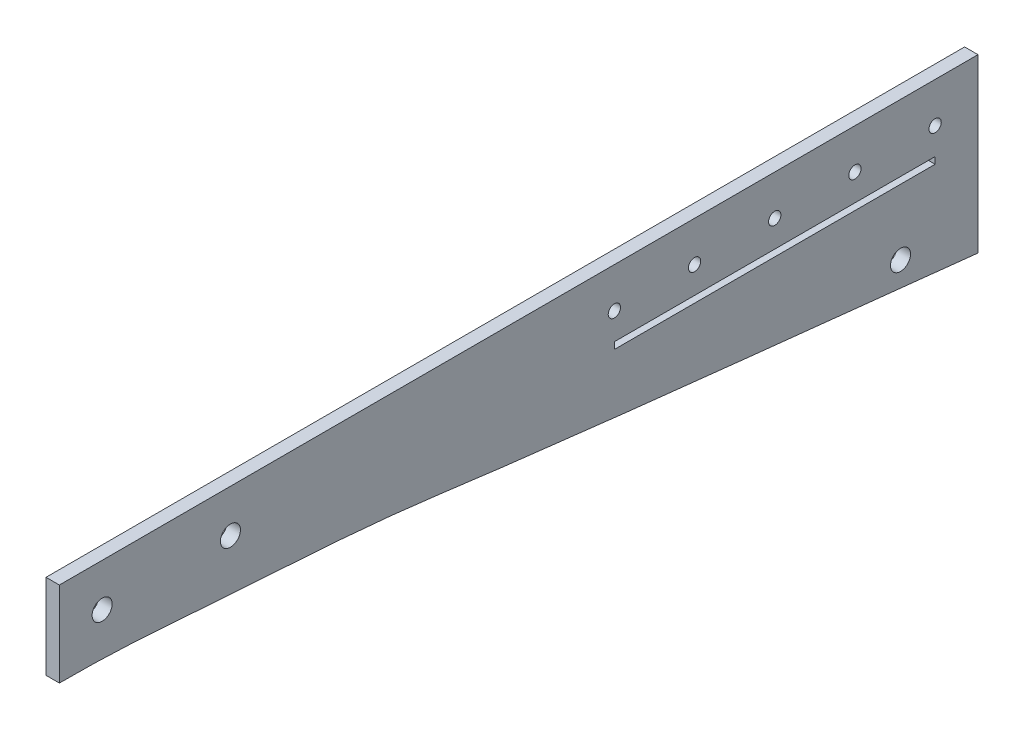
ISO-10303-21;
HEADER;
FILE_DESCRIPTION(('STEP AP214'),'2;1');
FILE_NAME('part.step','',(''),(''),'','','');
FILE_SCHEMA(('AUTOMOTIVE_DESIGN { 1 0 10303 214 1 1 1 1 }'));
ENDSEC;
DATA;
#1=APPLICATION_CONTEXT('core data for automotive mechanical design processes');
#2=APPLICATION_PROTOCOL_DEFINITION('international standard','automotive_design',2000,#1);
#3=PRODUCT_CONTEXT('',#1,'mechanical');
#4=PRODUCT('Part','Part','',(#3));
#5=PRODUCT_RELATED_PRODUCT_CATEGORY('part','',(#4));
#6=PRODUCT_DEFINITION_FORMATION('','',#4);
#7=PRODUCT_DEFINITION_CONTEXT('part definition',#1,'design');
#8=PRODUCT_DEFINITION('design','',#6,#7);
#9=PRODUCT_DEFINITION_SHAPE('','',#8);
#10=(LENGTH_UNIT() NAMED_UNIT(*) SI_UNIT(.MILLI.,.METRE.));
#11=(NAMED_UNIT(*) PLANE_ANGLE_UNIT() SI_UNIT($,.RADIAN.));
#12=(NAMED_UNIT(*) SI_UNIT($,.STERADIAN.) SOLID_ANGLE_UNIT());
#13=UNCERTAINTY_MEASURE_WITH_UNIT(LENGTH_MEASURE(1.E-05),#10,'distance_accuracy_value','');
#14=(GEOMETRIC_REPRESENTATION_CONTEXT(3) GLOBAL_UNCERTAINTY_ASSIGNED_CONTEXT((#13)) GLOBAL_UNIT_ASSIGNED_CONTEXT((#10,
#11,#12)) REPRESENTATION_CONTEXT('',''));
#15=CARTESIAN_POINT('',(0.,0.,0.));
#16=DIRECTION('',(0.,0.,1.));
#17=DIRECTION('',(1.,0.,0.));
#18=AXIS2_PLACEMENT_3D('',#15,#16,#17);
#19=CARTESIAN_POINT('',(-3.17500000000001,40.7784101367533,-130.30894448353));
#20=DIRECTION('',(1.,0.,0.));
#21=DIRECTION('',(0.,1.,0.));
#22=AXIS2_PLACEMENT_3D('',#19,#20,#21);
#23=PLANE('',#22);
#24=CARTESIAN_POINT('',(-3.17500000000001,30.48,-282.443003978403));
#25=DIRECTION('',(-1.,0.,0.));
#26=DIRECTION('',(0.,-1.,0.));
#27=AXIS2_PLACEMENT_3D('',#24,#25,#26);
#28=CIRCLE('',#27,2.38124999999995);
#29=CARTESIAN_POINT('',(-3.17500000000001,28.09875,-282.443003978403));
#30=VERTEX_POINT('',#29);
#31=EDGE_CURVE('E383',#30,#30,#28,.T.);
#32=ORIENTED_EDGE('',*,*,#31,.F.);
#33=EDGE_LOOP('',(#32));
#34=FACE_BOUND('',#33,.T.);
#35=CARTESIAN_POINT('',(-3.17500000000001,53.34,-92.7751596898495));
#36=DIRECTION('',(-1.,0.,0.));
#37=DIRECTION('',(0.,-1.,0.));
#38=AXIS2_PLACEMENT_3D('',#35,#36,#37);
#39=CIRCLE('',#38,2.38125);
#40=CARTESIAN_POINT('',(-3.17500000000001,50.95875,-92.7751596898495));
#41=VERTEX_POINT('',#40);
#42=EDGE_CURVE('E395',#41,#41,#39,.T.);
#43=ORIENTED_EDGE('',*,*,#42,.F.);
#44=EDGE_LOOP('',(#43));
#45=FACE_BOUND('',#44,.T.);
#46=CARTESIAN_POINT('',(-3.17500000000001,53.975,-214.470733083267));
#47=DIRECTION('',(-1.,0.,0.));
#48=DIRECTION('',(0.,-1.,0.));
#49=AXIS2_PLACEMENT_3D('',#46,#47,#48);
#50=CIRCLE('',#49,1.4605);
#51=CARTESIAN_POINT('',(-3.17500000000001,52.5145,-214.470733083267));
#52=VERTEX_POINT('',#51);
#53=EDGE_CURVE('E407',#52,#52,#50,.T.);
#54=ORIENTED_EDGE('',*,*,#53,.F.);
#55=EDGE_LOOP('',(#54));
#56=FACE_BOUND('',#55,.T.);
#57=CARTESIAN_POINT('',(-3.17500000000001,53.975,-271.620733083267));
#58=DIRECTION('',(-1.,0.,0.));
#59=DIRECTION('',(0.,-1.,0.));
#60=AXIS2_PLACEMENT_3D('',#57,#58,#59);
#61=CIRCLE('',#60,1.46050000000003);
#62=CARTESIAN_POINT('',(-3.17500000000001,52.5145,-271.620733083267));
#63=VERTEX_POINT('',#62);
#64=EDGE_CURVE('E131',#63,#63,#61,.T.);
#65=ORIENTED_EDGE('',*,*,#64,.F.);
#66=EDGE_LOOP('',(#65));
#67=FACE_BOUND('',#66,.T.);
#68=CARTESIAN_POINT('',(-3.17500000000001,43.3229282463699,-82.6151596898495));
#69=CARTESIAN_POINT('',(-3.17500000000001,43.3692227671806,-90.0325714773695));
#70=CARTESIAN_POINT('',(-3.17500000000001,42.9477476353276,-100.839437877737));
#71=CARTESIAN_POINT('',(-3.17500000000001,40.7341354720517,-128.258124464792));
#72=CARTESIAN_POINT('',(-3.17500000000001,39.5878222999372,-154.037568885067));
#73=CARTESIAN_POINT('',(-3.17500000000001,32.8482395620206,-203.771460985553));
#74=CARTESIAN_POINT('',(-3.17500000000001,27.1845585453096,-259.026017551498));
#75=CARTESIAN_POINT('',(-3.17500000000001,22.8294413784057,-299.505029795659));
#76=CARTESIAN_POINT('',(-3.17500000000001,22.6836142738887,-300.858003978388));
#77=B_SPLINE_CURVE_WITH_KNOTS('',3,(#68,#69,#70,#71,#72,#73,#74,#75,#76),.UNSPECIFIED.,.F.,.F.,
(4,1,1,1,1,1,4),(0.059441296217129,0.115503882074529,0.140922658912423,0.264510712533762,
0.30679732312031,0.521502154191359,0.528962462252977),.UNSPECIFIED.);
#78=CARTESIAN_POINT('',(-3.17500000000001,22.6836142738886,-300.858003978388));
#79=VERTEX_POINT('',#78);
#80=CARTESIAN_POINT('',(-3.17500000000001,43.3229282463699,-82.6151596898495));
#81=VERTEX_POINT('',#80);
#82=EDGE_CURVE('E165',#79,#81,#77,.F.);
#83=ORIENTED_EDGE('',*,*,#82,.T.);
#84=DIRECTION('',(0.,1.,0.));
#85=VECTOR('',#84,1.);
#86=CARTESIAN_POINT('',(-3.17500000000001,43.3229282463699,-82.6151596898495));
#87=LINE('',#86,#85);
#88=CARTESIAN_POINT('',(-3.17500000000001,63.5,-82.6151596898495));
#89=VERTEX_POINT('',#88);
#90=EDGE_CURVE('E150',#81,#89,#87,.T.);
#91=ORIENTED_EDGE('',*,*,#90,.T.);
#92=DIRECTION('',(0.,0.,-1.));
#93=VECTOR('',#92,1.);
#94=CARTESIAN_POINT('',(-3.17500000000001,63.5,-82.6151596898495));
#95=LINE('',#94,#93);
#96=CARTESIAN_POINT('',(-3.17500000000001,63.5,-300.858003978403));
#97=VERTEX_POINT('',#96);
#98=EDGE_CURVE('E144',#89,#97,#95,.T.);
#99=ORIENTED_EDGE('',*,*,#98,.T.);
#100=DIRECTION('',(0.,-1.,3.84886008865701E-13));
#101=VECTOR('',#100,1.);
#102=CARTESIAN_POINT('',(-3.17500000000001,63.5,-300.858003978403));
#103=LINE('',#102,#101);
#104=EDGE_CURVE('E149',#97,#79,#103,.T.);
#105=ORIENTED_EDGE('',*,*,#104,.T.);
#106=EDGE_LOOP('',(#83,#91,#99,#105));
#107=FACE_BOUND('',#106,.T.);
#108=DIRECTION('',(0.,-1.,0.));
#109=VECTOR('',#108,1.);
#110=CARTESIAN_POINT('',(-3.17500000000001,47.625,-290.670733083267));
#111=LINE('',#110,#109);
#112=CARTESIAN_POINT('',(-3.17500000000001,47.625,-290.670733083267));
#113=VERTEX_POINT('',#112);
#114=CARTESIAN_POINT('',(-3.17500000000001,46.0375,-290.670733083267));
#115=VERTEX_POINT('',#114);
#116=EDGE_CURVE('E101',#113,#115,#111,.T.);
#117=ORIENTED_EDGE('',*,*,#116,.F.);
#118=DIRECTION('',(0.,0.,-1.));
#119=VECTOR('',#118,1.);
#120=CARTESIAN_POINT('',(-3.17500000000001,47.625,-290.670733083267));
#121=LINE('',#120,#119);
#122=CARTESIAN_POINT('',(-3.17500000000001,47.625,-214.470733083267));
#123=VERTEX_POINT('',#122);
#124=EDGE_CURVE('E125',#123,#113,#121,.T.);
#125=ORIENTED_EDGE('',*,*,#124,.F.);
#126=DIRECTION('',(0.,1.,0.));
#127=VECTOR('',#126,1.);
#128=CARTESIAN_POINT('',(-3.17500000000001,47.625,-214.470733083267));
#129=LINE('',#128,#127);
#130=CARTESIAN_POINT('',(-3.17500000000001,46.0375,-214.470733083267));
#131=VERTEX_POINT('',#130);
#132=EDGE_CURVE('E123',#131,#123,#129,.T.);
#133=ORIENTED_EDGE('',*,*,#132,.F.);
#134=DIRECTION('',(0.,0.,1.));
#135=VECTOR('',#134,1.);
#136=CARTESIAN_POINT('',(-3.17500000000001,46.0375,-290.670733083267));
#137=LINE('',#136,#135);
#138=EDGE_CURVE('E110',#115,#131,#137,.T.);
#139=ORIENTED_EDGE('',*,*,#138,.F.);
#140=EDGE_LOOP('',(#117,#125,#133,#139));
#141=FACE_BOUND('',#140,.T.);
#142=CARTESIAN_POINT('',(-3.17500000000001,53.975,-233.520733083267));
#143=DIRECTION('',(-1.,0.,0.));
#144=DIRECTION('',(0.,-1.,0.));
#145=AXIS2_PLACEMENT_3D('',#142,#143,#144);
#146=CIRCLE('',#145,1.4605);
#147=CARTESIAN_POINT('',(-3.17500000000001,52.5145,-233.520733083267));
#148=VERTEX_POINT('',#147);
#149=EDGE_CURVE('E413',#148,#148,#146,.T.);
#150=ORIENTED_EDGE('',*,*,#149,.F.);
#151=EDGE_LOOP('',(#150));
#152=FACE_BOUND('',#151,.T.);
#153=CARTESIAN_POINT('',(-3.17500000000001,53.34,-123.25515968985));
#154=DIRECTION('',(-1.,0.,0.));
#155=DIRECTION('',(0.,-1.,0.));
#156=AXIS2_PLACEMENT_3D('',#153,#154,#155);
#157=CIRCLE('',#156,2.38125);
#158=CARTESIAN_POINT('',(-3.17500000000001,50.95875,-123.25515968985));
#159=VERTEX_POINT('',#158);
#160=EDGE_CURVE('E401',#159,#159,#157,.T.);
#161=ORIENTED_EDGE('',*,*,#160,.F.);
#162=EDGE_LOOP('',(#161));
#163=FACE_BOUND('',#162,.T.);
#164=CARTESIAN_POINT('',(-3.17500000000001,53.975,-290.670733083267));
#165=DIRECTION('',(-1.,0.,0.));
#166=DIRECTION('',(0.,-1.,0.));
#167=AXIS2_PLACEMENT_3D('',#164,#165,#166);
#168=CIRCLE('',#167,1.46050000000003);
#169=CARTESIAN_POINT('',(-3.17500000000001,52.5145,-290.670733083267));
#170=VERTEX_POINT('',#169);
#171=EDGE_CURVE('E389',#170,#170,#168,.T.);
#172=ORIENTED_EDGE('',*,*,#171,.F.);
#173=EDGE_LOOP('',(#172));
#174=FACE_BOUND('',#173,.T.);
#175=CARTESIAN_POINT('',(-3.17500000000001,53.975,-252.570733083267));
#176=DIRECTION('',(-1.,0.,0.));
#177=DIRECTION('',(0.,-1.,0.));
#178=AXIS2_PLACEMENT_3D('',#175,#176,#177);
#179=CIRCLE('',#178,1.46049999999997);
#180=CARTESIAN_POINT('',(-3.17500000000001,52.5145,-252.570733083267));
#181=VERTEX_POINT('',#180);
#182=EDGE_CURVE('E374',#181,#181,#179,.T.);
#183=ORIENTED_EDGE('',*,*,#182,.F.);
#184=EDGE_LOOP('',(#183));
#185=FACE_BOUND('',#184,.T.);
#186=ADVANCED_FACE('F32',(#34,#45,#56,#67,#107,#141,#152,#163,#174,#185),#23,.F.);
#187=CARTESIAN_POINT('',(0.,40.7784101367533,-130.30894448353));
#188=DIRECTION('',(1.,0.,0.));
#189=DIRECTION('',(0.,1.,0.));
#190=AXIS2_PLACEMENT_3D('',#187,#188,#189);
#191=PLANE('',#190);
#192=CARTESIAN_POINT('',(0.,30.48,-282.443003978403));
#193=DIRECTION('',(-1.,0.,0.));
#194=DIRECTION('',(0.,-1.,0.));
#195=AXIS2_PLACEMENT_3D('',#192,#193,#194);
#196=CIRCLE('',#195,2.38124999999995);
#197=CARTESIAN_POINT('',(0.,28.09875,-282.443003978403));
#198=VERTEX_POINT('',#197);
#199=EDGE_CURVE('E380',#198,#198,#196,.T.);
#200=ORIENTED_EDGE('',*,*,#199,.T.);
#201=EDGE_LOOP('',(#200));
#202=FACE_BOUND('',#201,.T.);
#203=CARTESIAN_POINT('',(0.,53.34,-92.7751596898495));
#204=DIRECTION('',(-1.,0.,0.));
#205=DIRECTION('',(0.,-1.,0.));
#206=AXIS2_PLACEMENT_3D('',#203,#204,#205);
#207=CIRCLE('',#206,2.38125);
#208=CARTESIAN_POINT('',(0.,50.95875,-92.7751596898495));
#209=VERTEX_POINT('',#208);
#210=EDGE_CURVE('E392',#209,#209,#207,.T.);
#211=ORIENTED_EDGE('',*,*,#210,.T.);
#212=EDGE_LOOP('',(#211));
#213=FACE_BOUND('',#212,.T.);
#214=CARTESIAN_POINT('',(0.,53.975,-214.470733083267));
#215=DIRECTION('',(-1.,0.,0.));
#216=DIRECTION('',(0.,-1.,0.));
#217=AXIS2_PLACEMENT_3D('',#214,#215,#216);
#218=CIRCLE('',#217,1.4605);
#219=CARTESIAN_POINT('',(0.,52.5145,-214.470733083267));
#220=VERTEX_POINT('',#219);
#221=EDGE_CURVE('E404',#220,#220,#218,.T.);
#222=ORIENTED_EDGE('',*,*,#221,.T.);
#223=EDGE_LOOP('',(#222));
#224=FACE_BOUND('',#223,.T.);
#225=CARTESIAN_POINT('',(0.,53.975,-271.620733083267));
#226=DIRECTION('',(-1.,0.,0.));
#227=DIRECTION('',(0.,-1.,0.));
#228=AXIS2_PLACEMENT_3D('',#225,#226,#227);
#229=CIRCLE('',#228,1.46050000000003);
#230=CARTESIAN_POINT('',(0.,52.5145,-271.620733083267));
#231=VERTEX_POINT('',#230);
#232=EDGE_CURVE('E416',#231,#231,#229,.T.);
#233=ORIENTED_EDGE('',*,*,#232,.T.);
#234=EDGE_LOOP('',(#233));
#235=FACE_BOUND('',#234,.T.);
#236=CARTESIAN_POINT('',(0.,22.6836142738887,-300.858003978388));
#237=CARTESIAN_POINT('',(0.,22.8294413784057,-299.505029795659));
#238=CARTESIAN_POINT('',(0.,27.1845585453096,-259.026017551498));
#239=CARTESIAN_POINT('',(0.,32.8482395620206,-203.771460985553));
#240=CARTESIAN_POINT('',(0.,39.5878222999372,-154.037568885067));
#241=CARTESIAN_POINT('',(0.,40.7341354720517,-128.258124464792));
#242=CARTESIAN_POINT('',(0.,42.9477476353276,-100.839437877737));
#243=CARTESIAN_POINT('',(0.,43.3692227671806,-90.0325714773695));
#244=CARTESIAN_POINT('',(0.,43.3229282463699,-82.6151596898495));
#245=B_SPLINE_CURVE_WITH_KNOTS('',3,(#236,#237,#238,#239,#240,#241,#242,#243,#244),
.UNSPECIFIED.,.F.,.F.,(4,1,1,1,1,1,4),(0.059441296217129,0.0669016042787479,0.281606435349796,
0.323893045936344,0.447481099557684,0.472899876395578,0.528962462252977),.UNSPECIFIED.);
#246=CARTESIAN_POINT('',(0.,22.6836142738886,-300.858003978388));
#247=VERTEX_POINT('',#246);
#248=CARTESIAN_POINT('',(0.,43.3229282463699,-82.6151596898495));
#249=VERTEX_POINT('',#248);
#250=EDGE_CURVE('E118',#247,#249,#245,.T.);
#251=ORIENTED_EDGE('',*,*,#250,.F.);
#252=DIRECTION('',(0.,-1.,3.84886008865701E-13));
#253=VECTOR('',#252,1.);
#254=CARTESIAN_POINT('',(0.,63.5,-300.858003978403));
#255=LINE('',#254,#253);
#256=CARTESIAN_POINT('',(0.,63.5,-300.858003978403));
#257=VERTEX_POINT('',#256);
#258=EDGE_CURVE('E153',#257,#247,#255,.T.);
#259=ORIENTED_EDGE('',*,*,#258,.F.);
#260=DIRECTION('',(0.,0.,-1.));
#261=VECTOR('',#260,1.);
#262=CARTESIAN_POINT('',(0.,63.5,-82.6151596898495));
#263=LINE('',#262,#261);
#264=CARTESIAN_POINT('',(0.,63.5,-82.6151596898495));
#265=VERTEX_POINT('',#264);
#266=EDGE_CURVE('E151',#265,#257,#263,.T.);
#267=ORIENTED_EDGE('',*,*,#266,.F.);
#268=DIRECTION('',(0.,1.,0.));
#269=VECTOR('',#268,1.);
#270=CARTESIAN_POINT('',(0.,43.3229282463699,-82.6151596898495));
#271=LINE('',#270,#269);
#272=EDGE_CURVE('E154',#249,#265,#271,.T.);
#273=ORIENTED_EDGE('',*,*,#272,.F.);
#274=EDGE_LOOP('',(#251,#259,#267,#273));
#275=FACE_BOUND('',#274,.T.);
#276=DIRECTION('',(0.,0.,-1.));
#277=VECTOR('',#276,1.);
#278=CARTESIAN_POINT('',(0.,47.625,-290.670733083267));
#279=LINE('',#278,#277);
#280=CARTESIAN_POINT('',(0.,47.625,-214.470733083267));
#281=VERTEX_POINT('',#280);
#282=CARTESIAN_POINT('',(0.,47.625,-290.670733083267));
#283=VERTEX_POINT('',#282);
#284=EDGE_CURVE('E111',#281,#283,#279,.T.);
#285=ORIENTED_EDGE('',*,*,#284,.T.);
#286=DIRECTION('',(0.,-1.,0.));
#287=VECTOR('',#286,1.);
#288=CARTESIAN_POINT('',(0.,47.625,-290.670733083267));
#289=LINE('',#288,#287);
#290=CARTESIAN_POINT('',(0.,46.0375,-290.670733083267));
#291=VERTEX_POINT('',#290);
#292=EDGE_CURVE('E59',#283,#291,#289,.T.);
#293=ORIENTED_EDGE('',*,*,#292,.T.);
#294=DIRECTION('',(0.,0.,1.));
#295=VECTOR('',#294,1.);
#296=CARTESIAN_POINT('',(0.,46.0375,-290.670733083267));
#297=LINE('',#296,#295);
#298=CARTESIAN_POINT('',(0.,46.0375,-214.470733083267));
#299=VERTEX_POINT('',#298);
#300=EDGE_CURVE('E117',#291,#299,#297,.T.);
#301=ORIENTED_EDGE('',*,*,#300,.T.);
#302=DIRECTION('',(0.,1.,0.));
#303=VECTOR('',#302,1.);
#304=CARTESIAN_POINT('',(0.,47.625,-214.470733083267));
#305=LINE('',#304,#303);
#306=EDGE_CURVE('E133',#299,#281,#305,.T.);
#307=ORIENTED_EDGE('',*,*,#306,.T.);
#308=EDGE_LOOP('',(#285,#293,#301,#307));
#309=FACE_BOUND('',#308,.T.);
#310=CARTESIAN_POINT('',(0.,53.975,-233.520733083267));
#311=DIRECTION('',(-1.,0.,0.));
#312=DIRECTION('',(0.,-1.,0.));
#313=AXIS2_PLACEMENT_3D('',#310,#311,#312);
#314=CIRCLE('',#313,1.4605);
#315=CARTESIAN_POINT('',(0.,52.5145,-233.520733083267));
#316=VERTEX_POINT('',#315);
#317=EDGE_CURVE('E410',#316,#316,#314,.T.);
#318=ORIENTED_EDGE('',*,*,#317,.T.);
#319=EDGE_LOOP('',(#318));
#320=FACE_BOUND('',#319,.T.);
#321=CARTESIAN_POINT('',(0.,53.34,-123.25515968985));
#322=DIRECTION('',(-1.,0.,0.));
#323=DIRECTION('',(0.,-1.,0.));
#324=AXIS2_PLACEMENT_3D('',#321,#322,#323);
#325=CIRCLE('',#324,2.38125);
#326=CARTESIAN_POINT('',(0.,50.95875,-123.25515968985));
#327=VERTEX_POINT('',#326);
#328=EDGE_CURVE('E398',#327,#327,#325,.T.);
#329=ORIENTED_EDGE('',*,*,#328,.T.);
#330=EDGE_LOOP('',(#329));
#331=FACE_BOUND('',#330,.T.);
#332=CARTESIAN_POINT('',(0.,53.975,-290.670733083267));
#333=DIRECTION('',(-1.,0.,0.));
#334=DIRECTION('',(0.,-1.,0.));
#335=AXIS2_PLACEMENT_3D('',#332,#333,#334);
#336=CIRCLE('',#335,1.46050000000003);
#337=CARTESIAN_POINT('',(0.,52.5145,-290.670733083267));
#338=VERTEX_POINT('',#337);
#339=EDGE_CURVE('E386',#338,#338,#336,.T.);
#340=ORIENTED_EDGE('',*,*,#339,.T.);
#341=EDGE_LOOP('',(#340));
#342=FACE_BOUND('',#341,.T.);
#343=CARTESIAN_POINT('',(0.,53.975,-252.570733083267));
#344=DIRECTION('',(-1.,0.,0.));
#345=DIRECTION('',(0.,-1.,0.));
#346=AXIS2_PLACEMENT_3D('',#343,#344,#345);
#347=CIRCLE('',#346,1.46049999999997);
#348=CARTESIAN_POINT('',(0.,52.5145,-252.570733083267));
#349=VERTEX_POINT('',#348);
#350=EDGE_CURVE('E377',#349,#349,#347,.T.);
#351=ORIENTED_EDGE('',*,*,#350,.T.);
#352=EDGE_LOOP('',(#351));
#353=FACE_BOUND('',#352,.T.);
#354=ADVANCED_FACE('F181',(#202,#213,#224,#235,#275,#309,#320,#331,#342,#353),#191,.T.);
#355=CARTESIAN_POINT('',(-3.17500000000001,20.6250512350006,-319.796703156955));
#356=CARTESIAN_POINT('',(-3.17500000000001,21.4470760235708,-312.297426065501));
#357=CARTESIAN_POINT('',(-3.17500000000001,26.4238026262619,-266.447909928182));
#358=CARTESIAN_POINT('',(-3.17500000000001,32.8482395620206,-203.771460985553));
#359=CARTESIAN_POINT('',(-3.17500000000001,39.5878222999372,-154.037568885067));
#360=CARTESIAN_POINT('',(-3.17500000000001,40.7341354720517,-128.258124464792));
#361=CARTESIAN_POINT('',(-3.17500000000001,43.3111951964629,-96.3376308607162));
#362=CARTESIAN_POINT('',(-3.17500000000001,43.8548371209846,-71.1195145592283));
#363=CARTESIAN_POINT('',(-3.17500000000001,39.5909848646941,-40.8950313271756));
#364=CARTESIAN_POINT('',(-3.17500000000001,34.7665269990676,-17.4215267783529));
#365=CARTESIAN_POINT('',(-3.17500000000001,30.2941403013763,0.946339756623144));
#366=CARTESIAN_POINT('',(-3.17500000000001,24.5311569093459,12.0337907686125));
#367=CARTESIAN_POINT('',(-3.17500000000001,20.6477769140798,17.7732218134462));
#368=CARTESIAN_POINT('',(-3.17500000000001,19.4181975790566,19.4436906483839));
#369=B_SPLINE_CURVE_WITH_KNOTS('',3,(#355,#356,#357,#358,#359,#360,#361,#362,#363,#364,#365,
#366,#367,#368),.UNSPECIFIED.,.F.,.F.,(4,1,1,1,1,1,1,1,1,1,1,4),(0.0239196569673538,
0.0669016042787479,0.281606435349796,0.323893045936344,0.447481099557684,0.472899876395578,
0.562632307612615,0.638258740173895,0.701932353586762,0.743677549842096,0.780003047829055,
0.795578271148197),.UNSPECIFIED.);
#370=DIRECTION('',(1.,0.,0.));
#371=VECTOR('',#370,1.);
#372=SURFACE_OF_LINEAR_EXTRUSION('',#369,#371);
#373=ORIENTED_EDGE('',*,*,#250,.T.);
#374=DIRECTION('',(1.,0.,0.));
#375=VECTOR('',#374,1.);
#376=CARTESIAN_POINT('',(-3.17500000000001,43.3229282463699,-82.6151596898495));
#377=LINE('',#376,#375);
#378=EDGE_CURVE('E11',#81,#249,#377,.T.);
#379=ORIENTED_EDGE('',*,*,#378,.F.);
#380=ORIENTED_EDGE('',*,*,#82,.F.);
#381=DIRECTION('',(1.,0.,0.));
#382=VECTOR('',#381,1.);
#383=CARTESIAN_POINT('',(-3.17500000000001,22.6836142738886,-300.858003978388));
#384=LINE('',#383,#382);
#385=EDGE_CURVE('E158',#79,#247,#384,.T.);
#386=ORIENTED_EDGE('',*,*,#385,.T.);
#387=EDGE_LOOP('',(#373,#379,#380,#386));
#388=FACE_BOUND('',#387,.T.);
#389=ADVANCED_FACE('F34',(#388),#372,.F.);
#390=CARTESIAN_POINT('',(-3.17500000000001,43.3229282463699,-82.6151596898495));
#391=DIRECTION('',(0.,0.,-1.));
#392=DIRECTION('',(-1.,0.,0.));
#393=AXIS2_PLACEMENT_3D('',#390,#391,#392);
#394=PLANE('',#393);
#395=ORIENTED_EDGE('',*,*,#272,.T.);
#396=DIRECTION('',(1.,0.,0.));
#397=VECTOR('',#396,1.);
#398=CARTESIAN_POINT('',(-3.17500000000001,63.5,-82.6151596898495));
#399=LINE('',#398,#397);
#400=EDGE_CURVE('E43',#89,#265,#399,.T.);
#401=ORIENTED_EDGE('',*,*,#400,.F.);
#402=ORIENTED_EDGE('',*,*,#90,.F.);
#403=ORIENTED_EDGE('',*,*,#378,.T.);
#404=EDGE_LOOP('',(#395,#401,#402,#403));
#405=FACE_BOUND('',#404,.T.);
#406=ADVANCED_FACE('F252',(#405),#394,.F.);
#407=CARTESIAN_POINT('',(-3.17500000000001,63.5,-82.6151596898495));
#408=DIRECTION('',(0.,-1.,0.));
#409=DIRECTION('',(1.,0.,0.));
#410=AXIS2_PLACEMENT_3D('',#407,#408,#409);
#411=PLANE('',#410);
#412=ORIENTED_EDGE('',*,*,#266,.T.);
#413=DIRECTION('',(1.,0.,0.));
#414=VECTOR('',#413,1.);
#415=CARTESIAN_POINT('',(-3.17500000000001,63.5,-300.858003978403));
#416=LINE('',#415,#414);
#417=EDGE_CURVE('E155',#97,#257,#416,.T.);
#418=ORIENTED_EDGE('',*,*,#417,.F.);
#419=ORIENTED_EDGE('',*,*,#98,.F.);
#420=ORIENTED_EDGE('',*,*,#400,.T.);
#421=EDGE_LOOP('',(#412,#418,#419,#420));
#422=FACE_BOUND('',#421,.T.);
#423=ADVANCED_FACE('F251',(#422),#411,.F.);
#424=CARTESIAN_POINT('',(-3.17500000000001,63.5,-300.858003978403));
#425=DIRECTION('',(0.,3.84886008865701E-13,1.));
#426=DIRECTION('',(0.,-1.,3.84886008865701E-13));
#427=AXIS2_PLACEMENT_3D('',#424,#425,#426);
#428=PLANE('',#427);
#429=ORIENTED_EDGE('',*,*,#258,.T.);
#430=ORIENTED_EDGE('',*,*,#385,.F.);
#431=ORIENTED_EDGE('',*,*,#104,.F.);
#432=ORIENTED_EDGE('',*,*,#417,.T.);
#433=EDGE_LOOP('',(#429,#430,#431,#432));
#434=FACE_BOUND('',#433,.T.);
#435=ADVANCED_FACE('F188',(#434),#428,.F.);
#436=CARTESIAN_POINT('',(-3.17500000000001,47.625,-290.670733083267));
#437=DIRECTION('',(0.,0.,1.));
#438=DIRECTION('',(1.,0.,0.));
#439=AXIS2_PLACEMENT_3D('',#436,#437,#438);
#440=PLANE('',#439);
#441=ORIENTED_EDGE('',*,*,#292,.F.);
#442=DIRECTION('',(1.,0.,0.));
#443=VECTOR('',#442,1.);
#444=CARTESIAN_POINT('',(-3.17500000000001,47.625,-290.670733083267));
#445=LINE('',#444,#443);
#446=EDGE_CURVE('E105',#113,#283,#445,.T.);
#447=ORIENTED_EDGE('',*,*,#446,.F.);
#448=ORIENTED_EDGE('',*,*,#116,.T.);
#449=DIRECTION('',(1.,0.,0.));
#450=VECTOR('',#449,1.);
#451=CARTESIAN_POINT('',(-3.17500000000001,46.0375,-290.670733083267));
#452=LINE('',#451,#450);
#453=EDGE_CURVE('E104',#115,#291,#452,.T.);
#454=ORIENTED_EDGE('',*,*,#453,.T.);
#455=EDGE_LOOP('',(#441,#447,#448,#454));
#456=FACE_BOUND('',#455,.T.);
#457=ADVANCED_FACE('F103',(#456),#440,.T.);
#458=CARTESIAN_POINT('',(-3.17500000000001,46.0375,-290.670733083267));
#459=DIRECTION('',(0.,1.,0.));
#460=DIRECTION('',(-1.,0.,0.));
#461=AXIS2_PLACEMENT_3D('',#458,#459,#460);
#462=PLANE('',#461);
#463=ORIENTED_EDGE('',*,*,#300,.F.);
#464=ORIENTED_EDGE('',*,*,#453,.F.);
#465=ORIENTED_EDGE('',*,*,#138,.T.);
#466=DIRECTION('',(1.,0.,0.));
#467=VECTOR('',#466,1.);
#468=CARTESIAN_POINT('',(-3.17500000000001,46.0375,-214.470733083267));
#469=LINE('',#468,#467);
#470=EDGE_CURVE('E119',#131,#299,#469,.T.);
#471=ORIENTED_EDGE('',*,*,#470,.T.);
#472=EDGE_LOOP('',(#463,#464,#465,#471));
#473=FACE_BOUND('',#472,.T.);
#474=ADVANCED_FACE('F114',(#473),#462,.T.);
#475=CARTESIAN_POINT('',(-3.17500000000001,47.625,-214.470733083267));
#476=DIRECTION('',(0.,0.,-1.));
#477=DIRECTION('',(-1.,0.,0.));
#478=AXIS2_PLACEMENT_3D('',#475,#476,#477);
#479=PLANE('',#478);
#480=ORIENTED_EDGE('',*,*,#306,.F.);
#481=ORIENTED_EDGE('',*,*,#470,.F.);
#482=ORIENTED_EDGE('',*,*,#132,.T.);
#483=DIRECTION('',(1.,0.,0.));
#484=VECTOR('',#483,1.);
#485=CARTESIAN_POINT('',(-3.17500000000001,47.625,-214.470733083267));
#486=LINE('',#485,#484);
#487=EDGE_CURVE('E51',#123,#281,#486,.T.);
#488=ORIENTED_EDGE('',*,*,#487,.T.);
#489=EDGE_LOOP('',(#480,#481,#482,#488));
#490=FACE_BOUND('',#489,.T.);
#491=ADVANCED_FACE('F292',(#490),#479,.T.);
#492=CARTESIAN_POINT('',(-3.17500000000001,47.625,-290.670733083267));
#493=DIRECTION('',(0.,-1.,0.));
#494=DIRECTION('',(0.,0.,-1.));
#495=AXIS2_PLACEMENT_3D('',#492,#493,#494);
#496=PLANE('',#495);
#497=ORIENTED_EDGE('',*,*,#284,.F.);
#498=ORIENTED_EDGE('',*,*,#487,.F.);
#499=ORIENTED_EDGE('',*,*,#124,.T.);
#500=ORIENTED_EDGE('',*,*,#446,.T.);
#501=EDGE_LOOP('',(#497,#498,#499,#500));
#502=FACE_BOUND('',#501,.T.);
#503=ADVANCED_FACE('F298',(#502),#496,.T.);
#504=CARTESIAN_POINT('',(-3.17500000000001,53.975,-271.620733083267));
#505=DIRECTION('',(1.,0.,0.));
#506=DIRECTION('',(0.,1.,0.));
#507=AXIS2_PLACEMENT_3D('',#504,#505,#506);
#508=CYLINDRICAL_SURFACE('',#507,1.46050000000003);
#509=ORIENTED_EDGE('',*,*,#64,.T.);
#510=EDGE_LOOP('',(#509));
#511=FACE_BOUND('',#510,.T.);
#512=ORIENTED_EDGE('',*,*,#232,.F.);
#513=EDGE_LOOP('',(#512));
#514=FACE_BOUND('',#513,.T.);
#515=ADVANCED_FACE('F306',(#511,#514),#508,.F.);
#516=CARTESIAN_POINT('',(-3.17500000000001,53.975,-233.520733083267));
#517=DIRECTION('',(1.,0.,0.));
#518=DIRECTION('',(0.,1.,0.));
#519=AXIS2_PLACEMENT_3D('',#516,#517,#518);
#520=CYLINDRICAL_SURFACE('',#519,1.4605);
#521=ORIENTED_EDGE('',*,*,#149,.T.);
#522=EDGE_LOOP('',(#521));
#523=FACE_BOUND('',#522,.T.);
#524=ORIENTED_EDGE('',*,*,#317,.F.);
#525=EDGE_LOOP('',(#524));
#526=FACE_BOUND('',#525,.T.);
#527=ADVANCED_FACE('F313',(#523,#526),#520,.F.);
#528=CARTESIAN_POINT('',(-3.17500000000001,53.975,-214.470733083267));
#529=DIRECTION('',(1.,0.,0.));
#530=DIRECTION('',(0.,1.,0.));
#531=AXIS2_PLACEMENT_3D('',#528,#529,#530);
#532=CYLINDRICAL_SURFACE('',#531,1.4605);
#533=ORIENTED_EDGE('',*,*,#53,.T.);
#534=EDGE_LOOP('',(#533));
#535=FACE_BOUND('',#534,.T.);
#536=ORIENTED_EDGE('',*,*,#221,.F.);
#537=EDGE_LOOP('',(#536));
#538=FACE_BOUND('',#537,.T.);
#539=ADVANCED_FACE('F321',(#535,#538),#532,.F.);
#540=CARTESIAN_POINT('',(-3.17500000000001,53.34,-123.25515968985));
#541=DIRECTION('',(1.,0.,0.));
#542=DIRECTION('',(0.,1.,0.));
#543=AXIS2_PLACEMENT_3D('',#540,#541,#542);
#544=CYLINDRICAL_SURFACE('',#543,2.38125);
#545=ORIENTED_EDGE('',*,*,#160,.T.);
#546=EDGE_LOOP('',(#545));
#547=FACE_BOUND('',#546,.T.);
#548=ORIENTED_EDGE('',*,*,#328,.F.);
#549=EDGE_LOOP('',(#548));
#550=FACE_BOUND('',#549,.T.);
#551=ADVANCED_FACE('F329',(#547,#550),#544,.F.);
#552=CARTESIAN_POINT('',(-3.17500000000001,53.34,-92.7751596898495));
#553=DIRECTION('',(1.,0.,0.));
#554=DIRECTION('',(0.,1.,0.));
#555=AXIS2_PLACEMENT_3D('',#552,#553,#554);
#556=CYLINDRICAL_SURFACE('',#555,2.38125);
#557=ORIENTED_EDGE('',*,*,#42,.T.);
#558=EDGE_LOOP('',(#557));
#559=FACE_BOUND('',#558,.T.);
#560=ORIENTED_EDGE('',*,*,#210,.F.);
#561=EDGE_LOOP('',(#560));
#562=FACE_BOUND('',#561,.T.);
#563=ADVANCED_FACE('F337',(#559,#562),#556,.F.);
#564=CARTESIAN_POINT('',(-3.17500000000001,53.975,-290.670733083267));
#565=DIRECTION('',(1.,0.,0.));
#566=DIRECTION('',(0.,1.,0.));
#567=AXIS2_PLACEMENT_3D('',#564,#565,#566);
#568=CYLINDRICAL_SURFACE('',#567,1.46050000000003);
#569=ORIENTED_EDGE('',*,*,#171,.T.);
#570=EDGE_LOOP('',(#569));
#571=FACE_BOUND('',#570,.T.);
#572=ORIENTED_EDGE('',*,*,#339,.F.);
#573=EDGE_LOOP('',(#572));
#574=FACE_BOUND('',#573,.T.);
#575=ADVANCED_FACE('F345',(#571,#574),#568,.F.);
#576=CARTESIAN_POINT('',(-3.17500000000001,30.48,-282.443003978403));
#577=DIRECTION('',(1.,0.,0.));
#578=DIRECTION('',(0.,1.,0.));
#579=AXIS2_PLACEMENT_3D('',#576,#577,#578);
#580=CYLINDRICAL_SURFACE('',#579,2.38124999999995);
#581=ORIENTED_EDGE('',*,*,#31,.T.);
#582=EDGE_LOOP('',(#581));
#583=FACE_BOUND('',#582,.T.);
#584=ORIENTED_EDGE('',*,*,#199,.F.);
#585=EDGE_LOOP('',(#584));
#586=FACE_BOUND('',#585,.T.);
#587=ADVANCED_FACE('F353',(#583,#586),#580,.F.);
#588=CARTESIAN_POINT('',(-3.17500000000001,53.975,-252.570733083267));
#589=DIRECTION('',(1.,0.,0.));
#590=DIRECTION('',(0.,1.,0.));
#591=AXIS2_PLACEMENT_3D('',#588,#589,#590);
#592=CYLINDRICAL_SURFACE('',#591,1.46049999999997);
#593=ORIENTED_EDGE('',*,*,#182,.T.);
#594=EDGE_LOOP('',(#593));
#595=FACE_BOUND('',#594,.T.);
#596=ORIENTED_EDGE('',*,*,#350,.F.);
#597=EDGE_LOOP('',(#596));
#598=FACE_BOUND('',#597,.T.);
#599=ADVANCED_FACE('F361',(#595,#598),#592,.F.);
#600=CLOSED_SHELL('',(#186,#354,#389,#406,#423,#435,#457,#474,#491,#503,#515,#527,#539,#551,
#563,#575,#587,#599));
#601=MANIFOLD_SOLID_BREP('B2',#600);
#602=ADVANCED_BREP_SHAPE_REPRESENTATION('',(#18,#601),#14);
#603=SHAPE_DEFINITION_REPRESENTATION(#9,#602);
ENDSEC;
END-ISO-10303-21;
